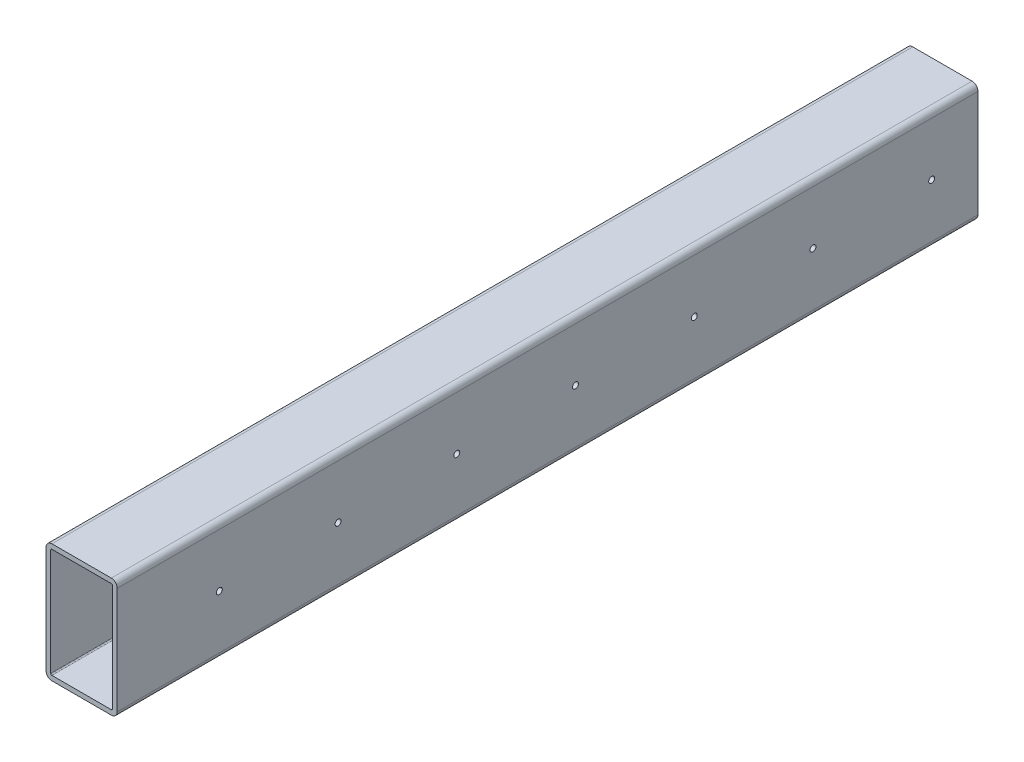
ISO-10303-21;
HEADER;
FILE_DESCRIPTION(('STEP AP214'),'2;1');
FILE_NAME('part.step','',(''),(''),'','','');
FILE_SCHEMA(('AUTOMOTIVE_DESIGN { 1 0 10303 214 1 1 1 1 }'));
ENDSEC;
DATA;
#1=APPLICATION_CONTEXT('core data for automotive mechanical design processes');
#2=APPLICATION_PROTOCOL_DEFINITION('international standard','automotive_design',2000,#1);
#3=PRODUCT_CONTEXT('',#1,'mechanical');
#4=PRODUCT('Part','Part','',(#3));
#5=PRODUCT_RELATED_PRODUCT_CATEGORY('part','',(#4));
#6=PRODUCT_DEFINITION_FORMATION('','',#4);
#7=PRODUCT_DEFINITION_CONTEXT('part definition',#1,'design');
#8=PRODUCT_DEFINITION('design','',#6,#7);
#9=PRODUCT_DEFINITION_SHAPE('','',#8);
#10=(LENGTH_UNIT() NAMED_UNIT(*) SI_UNIT(.MILLI.,.METRE.));
#11=(NAMED_UNIT(*) PLANE_ANGLE_UNIT() SI_UNIT($,.RADIAN.));
#12=(NAMED_UNIT(*) SI_UNIT($,.STERADIAN.) SOLID_ANGLE_UNIT());
#13=UNCERTAINTY_MEASURE_WITH_UNIT(LENGTH_MEASURE(1.E-05),#10,'distance_accuracy_value','');
#14=(GEOMETRIC_REPRESENTATION_CONTEXT(3) GLOBAL_UNCERTAINTY_ASSIGNED_CONTEXT((#13)) GLOBAL_UNIT_ASSIGNED_CONTEXT((#10,
#11,#12)) REPRESENTATION_CONTEXT('',''));
#15=CARTESIAN_POINT('',(0.,0.,0.));
#16=DIRECTION('',(0.,0.,1.));
#17=DIRECTION('',(1.,0.,0.));
#18=AXIS2_PLACEMENT_3D('',#15,#16,#17);
#19=CARTESIAN_POINT('',(50.,-90.0000000000002,725.));
#20=DIRECTION('',(0.,0.,-1.));
#21=DIRECTION('',(0.,1.,0.));
#22=AXIS2_PLACEMENT_3D('',#19,#20,#21);
#23=CYLINDRICAL_SURFACE('',#22,10.);
#24=CARTESIAN_POINT('',(50.,-89.9999999999997,-725.));
#25=DIRECTION('',(0.,0.,1.));
#26=DIRECTION('',(0.,-1.,0.));
#27=AXIS2_PLACEMENT_3D('',#24,#25,#26);
#28=CIRCLE('',#27,10.);
#29=CARTESIAN_POINT('',(50.,-99.9999999999997,-725.));
#30=VERTEX_POINT('',#29);
#31=CARTESIAN_POINT('',(60.,-89.9999999999997,-725.));
#32=VERTEX_POINT('',#31);
#33=EDGE_CURVE('E239',#30,#32,#28,.T.);
#34=ORIENTED_EDGE('',*,*,#33,.T.);
#35=DIRECTION('',(0.,0.,-1.));
#36=VECTOR('',#35,1.);
#37=CARTESIAN_POINT('',(60.,-90.0000000000002,725.));
#38=LINE('',#37,#36);
#39=CARTESIAN_POINT('',(60.,-90.0000000000002,725.));
#40=VERTEX_POINT('',#39);
#41=EDGE_CURVE('E12',#40,#32,#38,.T.);
#42=ORIENTED_EDGE('',*,*,#41,.F.);
#43=CARTESIAN_POINT('',(50.,-90.0000000000002,725.));
#44=DIRECTION('',(0.,0.,1.));
#45=DIRECTION('',(0.,-1.,0.));
#46=AXIS2_PLACEMENT_3D('',#43,#44,#45);
#47=CIRCLE('',#46,10.);
#48=CARTESIAN_POINT('',(50.,-100.,725.));
#49=VERTEX_POINT('',#48);
#50=EDGE_CURVE('E338',#49,#40,#47,.T.);
#51=ORIENTED_EDGE('',*,*,#50,.F.);
#52=DIRECTION('',(0.,0.,-1.));
#53=VECTOR('',#52,1.);
#54=CARTESIAN_POINT('',(50.,-100.,725.));
#55=LINE('',#54,#53);
#56=EDGE_CURVE('E254',#49,#30,#55,.T.);
#57=ORIENTED_EDGE('',*,*,#56,.T.);
#58=EDGE_LOOP('',(#34,#42,#51,#57));
#59=FACE_BOUND('',#58,.T.);
#60=ADVANCED_FACE('F65',(#59),#23,.T.);
#61=CARTESIAN_POINT('',(60.,-90.0000000000002,725.));
#62=DIRECTION('',(-1.,0.,0.));
#63=DIRECTION('',(0.,-1.,0.));
#64=AXIS2_PLACEMENT_3D('',#61,#62,#63);
#65=PLANE('',#64);
#66=CARTESIAN_POINT('',(60.,0.,-647.));
#67=DIRECTION('',(1.,0.,0.));
#68=DIRECTION('',(0.,1.,0.));
#69=AXIS2_PLACEMENT_3D('',#66,#67,#68);
#70=CIRCLE('',#69,5.00000000000004);
#71=CARTESIAN_POINT('',(60.,5.00000000000005,-647.));
#72=VERTEX_POINT('',#71);
#73=EDGE_CURVE('E497',#72,#72,#70,.T.);
#74=ORIENTED_EDGE('',*,*,#73,.F.);
#75=EDGE_LOOP('',(#74));
#76=FACE_BOUND('',#75,.T.);
#77=CARTESIAN_POINT('',(60.,0.,-447.));
#78=DIRECTION('',(1.,0.,0.));
#79=DIRECTION('',(0.,1.,0.));
#80=AXIS2_PLACEMENT_3D('',#77,#78,#79);
#81=CIRCLE('',#80,4.99999999999999);
#82=CARTESIAN_POINT('',(60.,4.99999999999994,-447.));
#83=VERTEX_POINT('',#82);
#84=EDGE_CURVE('E498',#83,#83,#81,.T.);
#85=ORIENTED_EDGE('',*,*,#84,.F.);
#86=EDGE_LOOP('',(#85));
#87=FACE_BOUND('',#86,.T.);
#88=CARTESIAN_POINT('',(60.,-1.15568474330593E-13,-247.));
#89=DIRECTION('',(1.,0.,0.));
#90=DIRECTION('',(0.,1.,0.));
#91=AXIS2_PLACEMENT_3D('',#88,#89,#90);
#92=CIRCLE('',#91,4.99999999999999);
#93=CARTESIAN_POINT('',(60.,4.99999999999987,-247.));
#94=VERTEX_POINT('',#93);
#95=EDGE_CURVE('E508',#94,#94,#92,.T.);
#96=ORIENTED_EDGE('',*,*,#95,.F.);
#97=EDGE_LOOP('',(#96));
#98=FACE_BOUND('',#97,.T.);
#99=CARTESIAN_POINT('',(60.,-1.76822158447843E-13,-46.9999999999999));
#100=DIRECTION('',(1.,0.,0.));
#101=DIRECTION('',(0.,1.,0.));
#102=AXIS2_PLACEMENT_3D('',#99,#100,#101);
#103=CIRCLE('',#102,5.);
#104=CARTESIAN_POINT('',(60.,4.99999999999983,-46.9999999999999));
#105=VERTEX_POINT('',#104);
#106=EDGE_CURVE('E514',#105,#105,#103,.T.);
#107=ORIENTED_EDGE('',*,*,#106,.F.);
#108=EDGE_LOOP('',(#107));
#109=FACE_BOUND('',#108,.T.);
#110=CARTESIAN_POINT('',(60.,-2.38075842565093E-13,153.));
#111=DIRECTION('',(1.,0.,0.));
#112=DIRECTION('',(0.,1.,0.));
#113=AXIS2_PLACEMENT_3D('',#110,#111,#112);
#114=CIRCLE('',#113,4.99999999999999);
#115=CARTESIAN_POINT('',(60.,4.99999999999975,153.));
#116=VERTEX_POINT('',#115);
#117=EDGE_CURVE('E520',#116,#116,#114,.T.);
#118=ORIENTED_EDGE('',*,*,#117,.F.);
#119=EDGE_LOOP('',(#118));
#120=FACE_BOUND('',#119,.T.);
#121=CARTESIAN_POINT('',(60.,-2.99329526682343E-13,353.));
#122=DIRECTION('',(1.,0.,0.));
#123=DIRECTION('',(0.,1.,0.));
#124=AXIS2_PLACEMENT_3D('',#121,#122,#123);
#125=CIRCLE('',#124,4.99999999999999);
#126=CARTESIAN_POINT('',(60.,4.99999999999969,353.));
#127=VERTEX_POINT('',#126);
#128=EDGE_CURVE('E526',#127,#127,#125,.T.);
#129=ORIENTED_EDGE('',*,*,#128,.F.);
#130=EDGE_LOOP('',(#129));
#131=FACE_BOUND('',#130,.T.);
#132=CARTESIAN_POINT('',(60.,-3.60583210799593E-13,553.));
#133=DIRECTION('',(1.,0.,0.));
#134=DIRECTION('',(0.,1.,0.));
#135=AXIS2_PLACEMENT_3D('',#132,#133,#134);
#136=CIRCLE('',#135,5.00000000000004);
#137=CARTESIAN_POINT('',(60.,4.99999999999968,553.));
#138=VERTEX_POINT('',#137);
#139=EDGE_CURVE('E532',#138,#138,#136,.T.);
#140=ORIENTED_EDGE('',*,*,#139,.F.);
#141=EDGE_LOOP('',(#140));
#142=FACE_BOUND('',#141,.T.);
#143=DIRECTION('',(0.,1.,0.));
#144=VECTOR('',#143,1.);
#145=CARTESIAN_POINT('',(60.,-89.9999999999997,-725.));
#146=LINE('',#145,#144);
#147=CARTESIAN_POINT('',(60.,90.0000000000003,-725.));
#148=VERTEX_POINT('',#147);
#149=EDGE_CURVE('E242',#32,#148,#146,.T.);
#150=ORIENTED_EDGE('',*,*,#149,.T.);
#151=DIRECTION('',(0.,0.,-1.));
#152=VECTOR('',#151,1.);
#153=CARTESIAN_POINT('',(60.,89.9999999999999,725.));
#154=LINE('',#153,#152);
#155=CARTESIAN_POINT('',(60.,89.9999999999999,725.));
#156=VERTEX_POINT('',#155);
#157=EDGE_CURVE('E75',#156,#148,#154,.T.);
#158=ORIENTED_EDGE('',*,*,#157,.F.);
#159=DIRECTION('',(0.,1.,0.));
#160=VECTOR('',#159,1.);
#161=CARTESIAN_POINT('',(60.,-90.0000000000002,725.));
#162=LINE('',#161,#160);
#163=EDGE_CURVE('E340',#40,#156,#162,.T.);
#164=ORIENTED_EDGE('',*,*,#163,.F.);
#165=ORIENTED_EDGE('',*,*,#41,.T.);
#166=EDGE_LOOP('',(#150,#158,#164,#165));
#167=FACE_BOUND('',#166,.T.);
#168=ADVANCED_FACE('F378',(#76,#87,#98,#109,#120,#131,#142,#167),#65,.F.);
#169=CARTESIAN_POINT('',(50.,89.9999999999999,725.));
#170=DIRECTION('',(0.,0.,-1.));
#171=DIRECTION('',(0.,1.,0.));
#172=AXIS2_PLACEMENT_3D('',#169,#170,#171);
#173=CYLINDRICAL_SURFACE('',#172,10.);
#174=CARTESIAN_POINT('',(50.,90.0000000000003,-725.));
#175=DIRECTION('',(0.,0.,1.));
#176=DIRECTION('',(0.,-1.,0.));
#177=AXIS2_PLACEMENT_3D('',#174,#175,#176);
#178=CIRCLE('',#177,10.);
#179=CARTESIAN_POINT('',(50.,100.,-725.));
#180=VERTEX_POINT('',#179);
#181=EDGE_CURVE('E244',#148,#180,#178,.T.);
#182=ORIENTED_EDGE('',*,*,#181,.T.);
#183=DIRECTION('',(0.,0.,-1.));
#184=VECTOR('',#183,1.);
#185=CARTESIAN_POINT('',(50.,99.9999999999999,725.));
#186=LINE('',#185,#184);
#187=CARTESIAN_POINT('',(50.,99.9999999999999,725.));
#188=VERTEX_POINT('',#187);
#189=EDGE_CURVE('E261',#188,#180,#186,.T.);
#190=ORIENTED_EDGE('',*,*,#189,.F.);
#191=CARTESIAN_POINT('',(50.,89.9999999999999,725.));
#192=DIRECTION('',(0.,0.,1.));
#193=DIRECTION('',(0.,-1.,0.));
#194=AXIS2_PLACEMENT_3D('',#191,#192,#193);
#195=CIRCLE('',#194,10.);
#196=EDGE_CURVE('E342',#156,#188,#195,.T.);
#197=ORIENTED_EDGE('',*,*,#196,.F.);
#198=ORIENTED_EDGE('',*,*,#157,.T.);
#199=EDGE_LOOP('',(#182,#190,#197,#198));
#200=FACE_BOUND('',#199,.T.);
#201=ADVANCED_FACE('F383',(#200),#173,.T.);
#202=CARTESIAN_POINT('',(-50.,99.9999999999998,725.));
#203=DIRECTION('',(0.,-1.,0.));
#204=DIRECTION('',(0.,0.,-1.));
#205=AXIS2_PLACEMENT_3D('',#202,#203,#204);
#206=PLANE('',#205);
#207=DIRECTION('',(-1.,0.,0.));
#208=VECTOR('',#207,1.);
#209=CARTESIAN_POINT('',(-50.,100.,-725.));
#210=LINE('',#209,#208);
#211=CARTESIAN_POINT('',(-50.,100.,-725.));
#212=VERTEX_POINT('',#211);
#213=EDGE_CURVE('E246',#180,#212,#210,.T.);
#214=ORIENTED_EDGE('',*,*,#213,.T.);
#215=DIRECTION('',(0.,0.,-1.));
#216=VECTOR('',#215,1.);
#217=CARTESIAN_POINT('',(-50.,99.9999999999998,725.));
#218=LINE('',#217,#216);
#219=CARTESIAN_POINT('',(-50.,99.9999999999998,725.));
#220=VERTEX_POINT('',#219);
#221=EDGE_CURVE('E258',#220,#212,#218,.T.);
#222=ORIENTED_EDGE('',*,*,#221,.F.);
#223=DIRECTION('',(-1.,0.,0.));
#224=VECTOR('',#223,1.);
#225=CARTESIAN_POINT('',(-50.,99.9999999999998,725.));
#226=LINE('',#225,#224);
#227=EDGE_CURVE('E344',#188,#220,#226,.T.);
#228=ORIENTED_EDGE('',*,*,#227,.F.);
#229=ORIENTED_EDGE('',*,*,#189,.T.);
#230=EDGE_LOOP('',(#214,#222,#228,#229));
#231=FACE_BOUND('',#230,.T.);
#232=ADVANCED_FACE('F350',(#231),#206,.F.);
#233=CARTESIAN_POINT('',(-50.,89.9999999999998,725.));
#234=DIRECTION('',(0.,0.,-1.));
#235=DIRECTION('',(0.,1.,0.));
#236=AXIS2_PLACEMENT_3D('',#233,#234,#235);
#237=CYLINDRICAL_SURFACE('',#236,10.);
#238=CARTESIAN_POINT('',(-50.,90.0000000000003,-725.));
#239=DIRECTION('',(0.,0.,1.));
#240=DIRECTION('',(0.,-1.,0.));
#241=AXIS2_PLACEMENT_3D('',#238,#239,#240);
#242=CIRCLE('',#241,10.);
#243=CARTESIAN_POINT('',(-60.,90.0000000000003,-725.));
#244=VERTEX_POINT('',#243);
#245=EDGE_CURVE('E248',#212,#244,#242,.T.);
#246=ORIENTED_EDGE('',*,*,#245,.T.);
#247=DIRECTION('',(0.,0.,-1.));
#248=VECTOR('',#247,1.);
#249=CARTESIAN_POINT('',(-60.,89.9999999999999,725.));
#250=LINE('',#249,#248);
#251=CARTESIAN_POINT('',(-60.,89.9999999999999,725.));
#252=VERTEX_POINT('',#251);
#253=EDGE_CURVE('E205',#252,#244,#250,.T.);
#254=ORIENTED_EDGE('',*,*,#253,.F.);
#255=CARTESIAN_POINT('',(-50.,89.9999999999998,725.));
#256=DIRECTION('',(0.,0.,1.));
#257=DIRECTION('',(0.,-1.,0.));
#258=AXIS2_PLACEMENT_3D('',#255,#256,#257);
#259=CIRCLE('',#258,10.);
#260=EDGE_CURVE('E196',#220,#252,#259,.T.);
#261=ORIENTED_EDGE('',*,*,#260,.F.);
#262=ORIENTED_EDGE('',*,*,#221,.T.);
#263=EDGE_LOOP('',(#246,#254,#261,#262));
#264=FACE_BOUND('',#263,.T.);
#265=ADVANCED_FACE('F354',(#264),#237,.T.);
#266=CARTESIAN_POINT('',(-60.,89.9999999999999,725.));
#267=DIRECTION('',(1.,0.,0.));
#268=DIRECTION('',(0.,1.,0.));
#269=AXIS2_PLACEMENT_3D('',#266,#267,#268);
#270=PLANE('',#269);
#271=CARTESIAN_POINT('',(-60.,0.,-647.));
#272=DIRECTION('',(1.,0.,0.));
#273=DIRECTION('',(0.,1.,0.));
#274=AXIS2_PLACEMENT_3D('',#271,#272,#273);
#275=CIRCLE('',#274,5.00000000000004);
#276=CARTESIAN_POINT('',(-60.,5.00000000000004,-647.));
#277=VERTEX_POINT('',#276);
#278=EDGE_CURVE('E284',#277,#277,#275,.T.);
#279=ORIENTED_EDGE('',*,*,#278,.T.);
#280=EDGE_LOOP('',(#279));
#281=FACE_BOUND('',#280,.T.);
#282=CARTESIAN_POINT('',(-60.,0.,-447.));
#283=DIRECTION('',(1.,0.,0.));
#284=DIRECTION('',(0.,1.,0.));
#285=AXIS2_PLACEMENT_3D('',#282,#283,#284);
#286=CIRCLE('',#285,4.99999999999999);
#287=CARTESIAN_POINT('',(-60.,4.99999999999992,-447.));
#288=VERTEX_POINT('',#287);
#289=EDGE_CURVE('E503',#288,#288,#286,.T.);
#290=ORIENTED_EDGE('',*,*,#289,.T.);
#291=EDGE_LOOP('',(#290));
#292=FACE_BOUND('',#291,.T.);
#293=CARTESIAN_POINT('',(-60.,-1.29446262138407E-13,-247.));
#294=DIRECTION('',(1.,0.,0.));
#295=DIRECTION('',(0.,1.,0.));
#296=AXIS2_PLACEMENT_3D('',#293,#294,#295);
#297=CIRCLE('',#296,4.99999999999999);
#298=CARTESIAN_POINT('',(-60.,4.99999999999986,-247.));
#299=VERTEX_POINT('',#298);
#300=EDGE_CURVE('E511',#299,#299,#297,.T.);
#301=ORIENTED_EDGE('',*,*,#300,.T.);
#302=EDGE_LOOP('',(#301));
#303=FACE_BOUND('',#302,.T.);
#304=CARTESIAN_POINT('',(-60.,-1.90699946255657E-13,-46.9999999999999));
#305=DIRECTION('',(1.,0.,0.));
#306=DIRECTION('',(0.,1.,0.));
#307=AXIS2_PLACEMENT_3D('',#304,#305,#306);
#308=CIRCLE('',#307,5.);
#309=CARTESIAN_POINT('',(-60.,4.99999999999981,-46.9999999999999));
#310=VERTEX_POINT('',#309);
#311=EDGE_CURVE('E517',#310,#310,#308,.T.);
#312=ORIENTED_EDGE('',*,*,#311,.T.);
#313=EDGE_LOOP('',(#312));
#314=FACE_BOUND('',#313,.T.);
#315=CARTESIAN_POINT('',(-60.,-2.51953630372907E-13,153.));
#316=DIRECTION('',(1.,0.,0.));
#317=DIRECTION('',(0.,1.,0.));
#318=AXIS2_PLACEMENT_3D('',#315,#316,#317);
#319=CIRCLE('',#318,4.99999999999999);
#320=CARTESIAN_POINT('',(-60.,4.99999999999974,153.));
#321=VERTEX_POINT('',#320);
#322=EDGE_CURVE('E523',#321,#321,#319,.T.);
#323=ORIENTED_EDGE('',*,*,#322,.T.);
#324=EDGE_LOOP('',(#323));
#325=FACE_BOUND('',#324,.T.);
#326=CARTESIAN_POINT('',(-60.,-3.13207314490157E-13,353.));
#327=DIRECTION('',(1.,0.,0.));
#328=DIRECTION('',(0.,1.,0.));
#329=AXIS2_PLACEMENT_3D('',#326,#327,#328);
#330=CIRCLE('',#329,4.99999999999999);
#331=CARTESIAN_POINT('',(-60.,4.99999999999968,353.));
#332=VERTEX_POINT('',#331);
#333=EDGE_CURVE('E529',#332,#332,#330,.T.);
#334=ORIENTED_EDGE('',*,*,#333,.T.);
#335=EDGE_LOOP('',(#334));
#336=FACE_BOUND('',#335,.T.);
#337=CARTESIAN_POINT('',(-60.,-3.74460998607407E-13,553.));
#338=DIRECTION('',(1.,0.,0.));
#339=DIRECTION('',(0.,1.,0.));
#340=AXIS2_PLACEMENT_3D('',#337,#338,#339);
#341=CIRCLE('',#340,5.00000000000004);
#342=CARTESIAN_POINT('',(-60.,4.99999999999967,553.));
#343=VERTEX_POINT('',#342);
#344=EDGE_CURVE('E535',#343,#343,#341,.T.);
#345=ORIENTED_EDGE('',*,*,#344,.T.);
#346=EDGE_LOOP('',(#345));
#347=FACE_BOUND('',#346,.T.);
#348=DIRECTION('',(0.,-1.,0.));
#349=VECTOR('',#348,1.);
#350=CARTESIAN_POINT('',(-60.,90.0000000000003,-725.));
#351=LINE('',#350,#349);
#352=CARTESIAN_POINT('',(-60.,-89.9999999999997,-725.));
#353=VERTEX_POINT('',#352);
#354=EDGE_CURVE('E204',#244,#353,#351,.T.);
#355=ORIENTED_EDGE('',*,*,#354,.T.);
#356=DIRECTION('',(0.,0.,-1.));
#357=VECTOR('',#356,1.);
#358=CARTESIAN_POINT('',(-60.,-90.0000000000002,725.));
#359=LINE('',#358,#357);
#360=CARTESIAN_POINT('',(-60.,-90.0000000000002,725.));
#361=VERTEX_POINT('',#360);
#362=EDGE_CURVE('E201',#361,#353,#359,.T.);
#363=ORIENTED_EDGE('',*,*,#362,.F.);
#364=DIRECTION('',(0.,-1.,0.));
#365=VECTOR('',#364,1.);
#366=CARTESIAN_POINT('',(-60.,89.9999999999999,725.));
#367=LINE('',#366,#365);
#368=EDGE_CURVE('E190',#252,#361,#367,.T.);
#369=ORIENTED_EDGE('',*,*,#368,.F.);
#370=ORIENTED_EDGE('',*,*,#253,.T.);
#371=EDGE_LOOP('',(#355,#363,#369,#370));
#372=FACE_BOUND('',#371,.T.);
#373=ADVANCED_FACE('F202',(#281,#292,#303,#314,#325,#336,#347,#372),#270,.F.);
#374=CARTESIAN_POINT('',(-50.,-90.0000000000002,725.));
#375=DIRECTION('',(0.,0.,-1.));
#376=DIRECTION('',(0.,1.,0.));
#377=AXIS2_PLACEMENT_3D('',#374,#375,#376);
#378=CYLINDRICAL_SURFACE('',#377,10.);
#379=CARTESIAN_POINT('',(-50.,-89.9999999999997,-725.));
#380=DIRECTION('',(0.,0.,1.));
#381=DIRECTION('',(0.,-1.,0.));
#382=AXIS2_PLACEMENT_3D('',#379,#380,#381);
#383=CIRCLE('',#382,10.);
#384=CARTESIAN_POINT('',(-50.,-99.9999999999997,-725.));
#385=VERTEX_POINT('',#384);
#386=EDGE_CURVE('E137',#353,#385,#383,.T.);
#387=ORIENTED_EDGE('',*,*,#386,.T.);
#388=DIRECTION('',(0.,0.,-1.));
#389=VECTOR('',#388,1.);
#390=CARTESIAN_POINT('',(-50.,-100.,725.));
#391=LINE('',#390,#389);
#392=CARTESIAN_POINT('',(-50.,-100.,725.));
#393=VERTEX_POINT('',#392);
#394=EDGE_CURVE('E206',#393,#385,#391,.T.);
#395=ORIENTED_EDGE('',*,*,#394,.F.);
#396=CARTESIAN_POINT('',(-50.,-90.0000000000002,725.));
#397=DIRECTION('',(0.,0.,1.));
#398=DIRECTION('',(0.,-1.,0.));
#399=AXIS2_PLACEMENT_3D('',#396,#397,#398);
#400=CIRCLE('',#399,10.);
#401=EDGE_CURVE('E194',#361,#393,#400,.T.);
#402=ORIENTED_EDGE('',*,*,#401,.F.);
#403=ORIENTED_EDGE('',*,*,#362,.T.);
#404=EDGE_LOOP('',(#387,#395,#402,#403));
#405=FACE_BOUND('',#404,.T.);
#406=ADVANCED_FACE('F208',(#405),#378,.T.);
#407=CARTESIAN_POINT('',(50.,89.9999999999999,725.));
#408=DIRECTION('',(0.,0.,-1.));
#409=DIRECTION('',(0.,1.,0.));
#410=AXIS2_PLACEMENT_3D('',#407,#408,#409);
#411=CYLINDRICAL_SURFACE('',#410,2.00000000000002);
#412=CARTESIAN_POINT('',(50.,90.0000000000003,-725.));
#413=DIRECTION('',(0.,0.,1.));
#414=DIRECTION('',(0.,-1.,0.));
#415=AXIS2_PLACEMENT_3D('',#412,#413,#414);
#416=CIRCLE('',#415,2.00000000000002);
#417=CARTESIAN_POINT('',(52.,90.0000000000003,-725.));
#418=VERTEX_POINT('',#417);
#419=CARTESIAN_POINT('',(50.,92.0000000000003,-725.));
#420=VERTEX_POINT('',#419);
#421=EDGE_CURVE('E214',#418,#420,#416,.T.);
#422=ORIENTED_EDGE('',*,*,#421,.F.);
#423=DIRECTION('',(0.,0.,-1.));
#424=VECTOR('',#423,1.);
#425=CARTESIAN_POINT('',(52.,89.9999999999998,725.));
#426=LINE('',#425,#424);
#427=CARTESIAN_POINT('',(52.,89.9999999999998,725.));
#428=VERTEX_POINT('',#427);
#429=EDGE_CURVE('E151',#428,#418,#426,.T.);
#430=ORIENTED_EDGE('',*,*,#429,.F.);
#431=CARTESIAN_POINT('',(50.,89.9999999999999,725.));
#432=DIRECTION('',(0.,0.,1.));
#433=DIRECTION('',(0.,-1.,0.));
#434=AXIS2_PLACEMENT_3D('',#431,#432,#433);
#435=CIRCLE('',#434,2.00000000000002);
#436=CARTESIAN_POINT('',(50.,91.9999999999999,725.));
#437=VERTEX_POINT('',#436);
#438=EDGE_CURVE('E253',#428,#437,#435,.T.);
#439=ORIENTED_EDGE('',*,*,#438,.T.);
#440=DIRECTION('',(0.,0.,-1.));
#441=VECTOR('',#440,1.);
#442=CARTESIAN_POINT('',(50.,91.9999999999999,725.));
#443=LINE('',#442,#441);
#444=EDGE_CURVE('E210',#437,#420,#443,.T.);
#445=ORIENTED_EDGE('',*,*,#444,.T.);
#446=EDGE_LOOP('',(#422,#430,#439,#445));
#447=FACE_BOUND('',#446,.T.);
#448=ADVANCED_FACE('F67',(#447),#411,.F.);
#449=CARTESIAN_POINT('',(52.,-90.0000000000002,725.));
#450=DIRECTION('',(-1.,0.,0.));
#451=DIRECTION('',(0.,-1.,0.));
#452=AXIS2_PLACEMENT_3D('',#449,#450,#451);
#453=PLANE('',#452);
#454=CARTESIAN_POINT('',(52.,0.,-647.));
#455=DIRECTION('',(-1.,0.,0.));
#456=DIRECTION('',(0.,-1.,0.));
#457=AXIS2_PLACEMENT_3D('',#454,#455,#456);
#458=CIRCLE('',#457,5.00000000000004);
#459=CARTESIAN_POINT('',(52.,-5.00000000000004,-647.));
#460=VERTEX_POINT('',#459);
#461=EDGE_CURVE('E218',#460,#460,#458,.T.);
#462=ORIENTED_EDGE('',*,*,#461,.F.);
#463=EDGE_LOOP('',(#462));
#464=FACE_BOUND('',#463,.T.);
#465=CARTESIAN_POINT('',(52.,0.,-447.));
#466=DIRECTION('',(-1.,0.,0.));
#467=DIRECTION('',(0.,-1.,0.));
#468=AXIS2_PLACEMENT_3D('',#465,#466,#467);
#469=CIRCLE('',#468,4.99999999999999);
#470=CARTESIAN_POINT('',(52.,-5.00000000000005,-447.));
#471=VERTEX_POINT('',#470);
#472=EDGE_CURVE('E302',#471,#471,#469,.T.);
#473=ORIENTED_EDGE('',*,*,#472,.F.);
#474=EDGE_LOOP('',(#473));
#475=FACE_BOUND('',#474,.T.);
#476=CARTESIAN_POINT('',(52.,-1.16493660184447E-13,-247.));
#477=DIRECTION('',(-1.,0.,0.));
#478=DIRECTION('',(0.,-1.,0.));
#479=AXIS2_PLACEMENT_3D('',#476,#477,#478);
#480=CIRCLE('',#479,4.99999999999999);
#481=CARTESIAN_POINT('',(52.,-5.00000000000011,-247.));
#482=VERTEX_POINT('',#481);
#483=EDGE_CURVE('E299',#482,#482,#480,.T.);
#484=ORIENTED_EDGE('',*,*,#483,.F.);
#485=EDGE_LOOP('',(#484));
#486=FACE_BOUND('',#485,.T.);
#487=CARTESIAN_POINT('',(52.,-1.77747344301697E-13,-46.9999999999999));
#488=DIRECTION('',(-1.,0.,0.));
#489=DIRECTION('',(0.,-1.,0.));
#490=AXIS2_PLACEMENT_3D('',#487,#488,#489);
#491=CIRCLE('',#490,5.);
#492=CARTESIAN_POINT('',(52.,-5.00000000000018,-46.9999999999999));
#493=VERTEX_POINT('',#492);
#494=EDGE_CURVE('E296',#493,#493,#491,.T.);
#495=ORIENTED_EDGE('',*,*,#494,.F.);
#496=EDGE_LOOP('',(#495));
#497=FACE_BOUND('',#496,.T.);
#498=CARTESIAN_POINT('',(52.,-2.39001028418947E-13,153.));
#499=DIRECTION('',(-1.,0.,0.));
#500=DIRECTION('',(0.,-1.,0.));
#501=AXIS2_PLACEMENT_3D('',#498,#499,#500);
#502=CIRCLE('',#501,4.99999999999999);
#503=CARTESIAN_POINT('',(52.,-5.00000000000023,153.));
#504=VERTEX_POINT('',#503);
#505=EDGE_CURVE('E292',#504,#504,#502,.T.);
#506=ORIENTED_EDGE('',*,*,#505,.F.);
#507=EDGE_LOOP('',(#506));
#508=FACE_BOUND('',#507,.T.);
#509=CARTESIAN_POINT('',(52.,-3.00254712536197E-13,353.));
#510=DIRECTION('',(-1.,0.,0.));
#511=DIRECTION('',(0.,-1.,0.));
#512=AXIS2_PLACEMENT_3D('',#509,#510,#511);
#513=CIRCLE('',#512,4.99999999999999);
#514=CARTESIAN_POINT('',(52.,-5.00000000000029,353.));
#515=VERTEX_POINT('',#514);
#516=EDGE_CURVE('E288',#515,#515,#513,.T.);
#517=ORIENTED_EDGE('',*,*,#516,.F.);
#518=EDGE_LOOP('',(#517));
#519=FACE_BOUND('',#518,.T.);
#520=CARTESIAN_POINT('',(52.,-3.61508396653447E-13,553.));
#521=DIRECTION('',(-1.,0.,0.));
#522=DIRECTION('',(0.,-1.,0.));
#523=AXIS2_PLACEMENT_3D('',#520,#521,#522);
#524=CIRCLE('',#523,5.00000000000004);
#525=CARTESIAN_POINT('',(52.,-5.00000000000041,553.));
#526=VERTEX_POINT('',#525);
#527=EDGE_CURVE('E283',#526,#526,#524,.T.);
#528=ORIENTED_EDGE('',*,*,#527,.F.);
#529=EDGE_LOOP('',(#528));
#530=FACE_BOUND('',#529,.T.);
#531=DIRECTION('',(0.,1.,0.));
#532=VECTOR('',#531,1.);
#533=CARTESIAN_POINT('',(52.,-89.9999999999997,-725.));
#534=LINE('',#533,#532);
#535=CARTESIAN_POINT('',(52.,-89.9999999999997,-725.));
#536=VERTEX_POINT('',#535);
#537=EDGE_CURVE('E217',#536,#418,#534,.T.);
#538=ORIENTED_EDGE('',*,*,#537,.F.);
#539=DIRECTION('',(0.,0.,-1.));
#540=VECTOR('',#539,1.);
#541=CARTESIAN_POINT('',(52.,-90.0000000000002,725.));
#542=LINE('',#541,#540);
#543=CARTESIAN_POINT('',(52.,-90.0000000000002,725.));
#544=VERTEX_POINT('',#543);
#545=EDGE_CURVE('E277',#544,#536,#542,.T.);
#546=ORIENTED_EDGE('',*,*,#545,.F.);
#547=DIRECTION('',(0.,1.,0.));
#548=VECTOR('',#547,1.);
#549=CARTESIAN_POINT('',(52.,-90.0000000000002,725.));
#550=LINE('',#549,#548);
#551=EDGE_CURVE('E317',#544,#428,#550,.T.);
#552=ORIENTED_EDGE('',*,*,#551,.T.);
#553=ORIENTED_EDGE('',*,*,#429,.T.);
#554=EDGE_LOOP('',(#538,#546,#552,#553));
#555=FACE_BOUND('',#554,.T.);
#556=ADVANCED_FACE('F405',(#464,#475,#486,#497,#508,#519,#530,#555),#453,.T.);
#557=CARTESIAN_POINT('',(50.,-90.0000000000002,725.));
#558=DIRECTION('',(0.,0.,-1.));
#559=DIRECTION('',(0.,1.,0.));
#560=AXIS2_PLACEMENT_3D('',#557,#558,#559);
#561=CYLINDRICAL_SURFACE('',#560,2.00000000000002);
#562=CARTESIAN_POINT('',(50.,-89.9999999999997,-725.));
#563=DIRECTION('',(0.,0.,1.));
#564=DIRECTION('',(0.,-1.,0.));
#565=AXIS2_PLACEMENT_3D('',#562,#563,#564);
#566=CIRCLE('',#565,2.00000000000002);
#567=CARTESIAN_POINT('',(50.,-91.9999999999998,-725.));
#568=VERTEX_POINT('',#567);
#569=EDGE_CURVE('E221',#568,#536,#566,.T.);
#570=ORIENTED_EDGE('',*,*,#569,.F.);
#571=DIRECTION('',(0.,0.,-1.));
#572=VECTOR('',#571,1.);
#573=CARTESIAN_POINT('',(50.,-92.0000000000002,725.));
#574=LINE('',#573,#572);
#575=CARTESIAN_POINT('',(50.,-92.0000000000002,725.));
#576=VERTEX_POINT('',#575);
#577=EDGE_CURVE('E275',#576,#568,#574,.T.);
#578=ORIENTED_EDGE('',*,*,#577,.F.);
#579=CARTESIAN_POINT('',(50.,-90.0000000000002,725.));
#580=DIRECTION('',(0.,0.,1.));
#581=DIRECTION('',(0.,-1.,0.));
#582=AXIS2_PLACEMENT_3D('',#579,#580,#581);
#583=CIRCLE('',#582,2.00000000000002);
#584=EDGE_CURVE('E320',#576,#544,#583,.T.);
#585=ORIENTED_EDGE('',*,*,#584,.T.);
#586=ORIENTED_EDGE('',*,*,#545,.T.);
#587=EDGE_LOOP('',(#570,#578,#585,#586));
#588=FACE_BOUND('',#587,.T.);
#589=ADVANCED_FACE('F402',(#588),#561,.F.);
#590=CARTESIAN_POINT('',(50.,-92.0000000000002,725.));
#591=DIRECTION('',(0.,1.,0.));
#592=DIRECTION('',(0.,0.,1.));
#593=AXIS2_PLACEMENT_3D('',#590,#591,#592);
#594=PLANE('',#593);
#595=DIRECTION('',(1.,0.,0.));
#596=VECTOR('',#595,1.);
#597=CARTESIAN_POINT('',(50.,-91.9999999999997,-725.));
#598=LINE('',#597,#596);
#599=CARTESIAN_POINT('',(-50.,-91.9999999999997,-725.));
#600=VERTEX_POINT('',#599);
#601=EDGE_CURVE('E224',#600,#568,#598,.T.);
#602=ORIENTED_EDGE('',*,*,#601,.F.);
#603=DIRECTION('',(0.,0.,-1.));
#604=VECTOR('',#603,1.);
#605=CARTESIAN_POINT('',(-50.,-92.0000000000002,725.));
#606=LINE('',#605,#604);
#607=CARTESIAN_POINT('',(-50.,-92.0000000000002,725.));
#608=VERTEX_POINT('',#607);
#609=EDGE_CURVE('E273',#608,#600,#606,.T.);
#610=ORIENTED_EDGE('',*,*,#609,.F.);
#611=DIRECTION('',(1.,0.,0.));
#612=VECTOR('',#611,1.);
#613=CARTESIAN_POINT('',(50.,-92.0000000000002,725.));
#614=LINE('',#613,#612);
#615=EDGE_CURVE('E323',#608,#576,#614,.T.);
#616=ORIENTED_EDGE('',*,*,#615,.T.);
#617=ORIENTED_EDGE('',*,*,#577,.T.);
#618=EDGE_LOOP('',(#602,#610,#616,#617));
#619=FACE_BOUND('',#618,.T.);
#620=ADVANCED_FACE('F398',(#619),#594,.T.);
#621=CARTESIAN_POINT('',(-50.,-90.0000000000002,725.));
#622=DIRECTION('',(0.,0.,-1.));
#623=DIRECTION('',(0.,1.,0.));
#624=AXIS2_PLACEMENT_3D('',#621,#622,#623);
#625=CYLINDRICAL_SURFACE('',#624,2.00000000000002);
#626=CARTESIAN_POINT('',(-50.,-89.9999999999997,-725.));
#627=DIRECTION('',(0.,0.,1.));
#628=DIRECTION('',(0.,-1.,0.));
#629=AXIS2_PLACEMENT_3D('',#626,#627,#628);
#630=CIRCLE('',#629,2.00000000000002);
#631=CARTESIAN_POINT('',(-52.,-89.9999999999997,-725.));
#632=VERTEX_POINT('',#631);
#633=EDGE_CURVE('E227',#632,#600,#630,.T.);
#634=ORIENTED_EDGE('',*,*,#633,.F.);
#635=DIRECTION('',(0.,0.,-1.));
#636=VECTOR('',#635,1.);
#637=CARTESIAN_POINT('',(-52.,-90.0000000000002,725.));
#638=LINE('',#637,#636);
#639=CARTESIAN_POINT('',(-52.,-90.0000000000002,725.));
#640=VERTEX_POINT('',#639);
#641=EDGE_CURVE('E271',#640,#632,#638,.T.);
#642=ORIENTED_EDGE('',*,*,#641,.F.);
#643=CARTESIAN_POINT('',(-50.,-90.0000000000002,725.));
#644=DIRECTION('',(0.,0.,1.));
#645=DIRECTION('',(0.,-1.,0.));
#646=AXIS2_PLACEMENT_3D('',#643,#644,#645);
#647=CIRCLE('',#646,2.00000000000002);
#648=EDGE_CURVE('E326',#640,#608,#647,.T.);
#649=ORIENTED_EDGE('',*,*,#648,.T.);
#650=ORIENTED_EDGE('',*,*,#609,.T.);
#651=EDGE_LOOP('',(#634,#642,#649,#650));
#652=FACE_BOUND('',#651,.T.);
#653=ADVANCED_FACE('F394',(#652),#625,.F.);
#654=CARTESIAN_POINT('',(-52.,89.9999999999998,725.));
#655=DIRECTION('',(1.,0.,0.));
#656=DIRECTION('',(0.,1.,0.));
#657=AXIS2_PLACEMENT_3D('',#654,#655,#656);
#658=PLANE('',#657);
#659=CARTESIAN_POINT('',(-52.,0.,-647.));
#660=DIRECTION('',(1.,0.,0.));
#661=DIRECTION('',(0.,1.,0.));
#662=AXIS2_PLACEMENT_3D('',#659,#660,#661);
#663=CIRCLE('',#662,5.00000000000004);
#664=CARTESIAN_POINT('',(-52.,5.00000000000004,-647.));
#665=VERTEX_POINT('',#664);
#666=EDGE_CURVE('E69',#665,#665,#663,.T.);
#667=ORIENTED_EDGE('',*,*,#666,.F.);
#668=EDGE_LOOP('',(#667));
#669=FACE_BOUND('',#668,.T.);
#670=CARTESIAN_POINT('',(-52.,0.,-447.));
#671=DIRECTION('',(1.,0.,0.));
#672=DIRECTION('',(0.,1.,0.));
#673=AXIS2_PLACEMENT_3D('',#670,#671,#672);
#674=CIRCLE('',#673,4.99999999999999);
#675=CARTESIAN_POINT('',(-52.,4.99999999999992,-447.));
#676=VERTEX_POINT('',#675);
#677=EDGE_CURVE('E300',#676,#676,#674,.T.);
#678=ORIENTED_EDGE('',*,*,#677,.F.);
#679=EDGE_LOOP('',(#678));
#680=FACE_BOUND('',#679,.T.);
#681=CARTESIAN_POINT('',(-52.,-1.28521076284553E-13,-247.));
#682=DIRECTION('',(1.,0.,0.));
#683=DIRECTION('',(0.,1.,0.));
#684=AXIS2_PLACEMENT_3D('',#681,#682,#683);
#685=CIRCLE('',#684,4.99999999999999);
#686=CARTESIAN_POINT('',(-52.,4.99999999999986,-247.));
#687=VERTEX_POINT('',#686);
#688=EDGE_CURVE('E297',#687,#687,#685,.T.);
#689=ORIENTED_EDGE('',*,*,#688,.F.);
#690=EDGE_LOOP('',(#689));
#691=FACE_BOUND('',#690,.T.);
#692=CARTESIAN_POINT('',(-52.,-1.89774760401803E-13,-46.9999999999999));
#693=DIRECTION('',(1.,0.,0.));
#694=DIRECTION('',(0.,1.,0.));
#695=AXIS2_PLACEMENT_3D('',#692,#693,#694);
#696=CIRCLE('',#695,5.);
#697=CARTESIAN_POINT('',(-52.,4.99999999999981,-46.9999999999999));
#698=VERTEX_POINT('',#697);
#699=EDGE_CURVE('E293',#698,#698,#696,.T.);
#700=ORIENTED_EDGE('',*,*,#699,.F.);
#701=EDGE_LOOP('',(#700));
#702=FACE_BOUND('',#701,.T.);
#703=CARTESIAN_POINT('',(-52.,-2.51028444519053E-13,153.));
#704=DIRECTION('',(1.,0.,0.));
#705=DIRECTION('',(0.,1.,0.));
#706=AXIS2_PLACEMENT_3D('',#703,#704,#705);
#707=CIRCLE('',#706,4.99999999999999);
#708=CARTESIAN_POINT('',(-52.,4.99999999999974,153.));
#709=VERTEX_POINT('',#708);
#710=EDGE_CURVE('E289',#709,#709,#707,.T.);
#711=ORIENTED_EDGE('',*,*,#710,.F.);
#712=EDGE_LOOP('',(#711));
#713=FACE_BOUND('',#712,.T.);
#714=CARTESIAN_POINT('',(-52.,-3.12282128636303E-13,353.));
#715=DIRECTION('',(1.,0.,0.));
#716=DIRECTION('',(0.,1.,0.));
#717=AXIS2_PLACEMENT_3D('',#714,#715,#716);
#718=CIRCLE('',#717,4.99999999999999);
#719=CARTESIAN_POINT('',(-52.,4.99999999999968,353.));
#720=VERTEX_POINT('',#719);
#721=EDGE_CURVE('E285',#720,#720,#718,.T.);
#722=ORIENTED_EDGE('',*,*,#721,.F.);
#723=EDGE_LOOP('',(#722));
#724=FACE_BOUND('',#723,.T.);
#725=CARTESIAN_POINT('',(-52.,-3.73535812753553E-13,553.));
#726=DIRECTION('',(1.,0.,0.));
#727=DIRECTION('',(0.,1.,0.));
#728=AXIS2_PLACEMENT_3D('',#725,#726,#727);
#729=CIRCLE('',#728,5.00000000000004);
#730=CARTESIAN_POINT('',(-52.,4.99999999999967,553.));
#731=VERTEX_POINT('',#730);
#732=EDGE_CURVE('E280',#731,#731,#729,.T.);
#733=ORIENTED_EDGE('',*,*,#732,.F.);
#734=EDGE_LOOP('',(#733));
#735=FACE_BOUND('',#734,.T.);
#736=DIRECTION('',(0.,-1.,0.));
#737=VECTOR('',#736,1.);
#738=CARTESIAN_POINT('',(-52.,90.0000000000003,-725.));
#739=LINE('',#738,#737);
#740=CARTESIAN_POINT('',(-52.,90.0000000000003,-725.));
#741=VERTEX_POINT('',#740);
#742=EDGE_CURVE('E230',#741,#632,#739,.T.);
#743=ORIENTED_EDGE('',*,*,#742,.F.);
#744=DIRECTION('',(0.,0.,-1.));
#745=VECTOR('',#744,1.);
#746=CARTESIAN_POINT('',(-52.,89.9999999999998,725.));
#747=LINE('',#746,#745);
#748=CARTESIAN_POINT('',(-52.,89.9999999999998,725.));
#749=VERTEX_POINT('',#748);
#750=EDGE_CURVE('E269',#749,#741,#747,.T.);
#751=ORIENTED_EDGE('',*,*,#750,.F.);
#752=DIRECTION('',(0.,-1.,0.));
#753=VECTOR('',#752,1.);
#754=CARTESIAN_POINT('',(-52.,89.9999999999998,725.));
#755=LINE('',#754,#753);
#756=EDGE_CURVE('E329',#749,#640,#755,.T.);
#757=ORIENTED_EDGE('',*,*,#756,.T.);
#758=ORIENTED_EDGE('',*,*,#641,.T.);
#759=EDGE_LOOP('',(#743,#751,#757,#758));
#760=FACE_BOUND('',#759,.T.);
#761=ADVANCED_FACE('F390',(#669,#680,#691,#702,#713,#724,#735,#760),#658,.T.);
#762=CARTESIAN_POINT('',(-50.,89.9999999999998,725.));
#763=DIRECTION('',(0.,0.,-1.));
#764=DIRECTION('',(0.,1.,0.));
#765=AXIS2_PLACEMENT_3D('',#762,#763,#764);
#766=CYLINDRICAL_SURFACE('',#765,2.);
#767=CARTESIAN_POINT('',(-50.,90.0000000000003,-725.));
#768=DIRECTION('',(0.,0.,1.));
#769=DIRECTION('',(0.,-1.,0.));
#770=AXIS2_PLACEMENT_3D('',#767,#768,#769);
#771=CIRCLE('',#770,2.);
#772=CARTESIAN_POINT('',(-50.,92.0000000000003,-725.));
#773=VERTEX_POINT('',#772);
#774=EDGE_CURVE('E233',#773,#741,#771,.T.);
#775=ORIENTED_EDGE('',*,*,#774,.F.);
#776=DIRECTION('',(0.,0.,-1.));
#777=VECTOR('',#776,1.);
#778=CARTESIAN_POINT('',(-50.,91.9999999999998,725.));
#779=LINE('',#778,#777);
#780=CARTESIAN_POINT('',(-50.,91.9999999999998,725.));
#781=VERTEX_POINT('',#780);
#782=EDGE_CURVE('E267',#781,#773,#779,.T.);
#783=ORIENTED_EDGE('',*,*,#782,.F.);
#784=CARTESIAN_POINT('',(-50.,89.9999999999998,725.));
#785=DIRECTION('',(0.,0.,1.));
#786=DIRECTION('',(0.,-1.,0.));
#787=AXIS2_PLACEMENT_3D('',#784,#785,#786);
#788=CIRCLE('',#787,2.);
#789=EDGE_CURVE('E332',#781,#749,#788,.T.);
#790=ORIENTED_EDGE('',*,*,#789,.T.);
#791=ORIENTED_EDGE('',*,*,#750,.T.);
#792=EDGE_LOOP('',(#775,#783,#790,#791));
#793=FACE_BOUND('',#792,.T.);
#794=ADVANCED_FACE('F372',(#793),#766,.F.);
#795=CARTESIAN_POINT('',(-50.,91.9999999999998,725.));
#796=DIRECTION('',(0.,-1.,0.));
#797=DIRECTION('',(0.,0.,-1.));
#798=AXIS2_PLACEMENT_3D('',#795,#796,#797);
#799=PLANE('',#798);
#800=DIRECTION('',(-1.,0.,0.));
#801=VECTOR('',#800,1.);
#802=CARTESIAN_POINT('',(-50.,92.0000000000003,-725.));
#803=LINE('',#802,#801);
#804=EDGE_CURVE('E236',#420,#773,#803,.T.);
#805=ORIENTED_EDGE('',*,*,#804,.F.);
#806=ORIENTED_EDGE('',*,*,#444,.F.);
#807=DIRECTION('',(-1.,0.,0.));
#808=VECTOR('',#807,1.);
#809=CARTESIAN_POINT('',(-50.,91.9999999999998,725.));
#810=LINE('',#809,#808);
#811=EDGE_CURVE('E335',#437,#781,#810,.T.);
#812=ORIENTED_EDGE('',*,*,#811,.T.);
#813=ORIENTED_EDGE('',*,*,#782,.T.);
#814=EDGE_LOOP('',(#805,#806,#812,#813));
#815=FACE_BOUND('',#814,.T.);
#816=ADVANCED_FACE('F364',(#815),#799,.T.);
#817=CARTESIAN_POINT('',(50.,-100.,725.));
#818=DIRECTION('',(0.,1.,0.));
#819=DIRECTION('',(0.,0.,1.));
#820=AXIS2_PLACEMENT_3D('',#817,#818,#819);
#821=PLANE('',#820);
#822=DIRECTION('',(1.,0.,0.));
#823=VECTOR('',#822,1.);
#824=CARTESIAN_POINT('',(50.,-99.9999999999997,-725.));
#825=LINE('',#824,#823);
#826=EDGE_CURVE('E143',#385,#30,#825,.T.);
#827=ORIENTED_EDGE('',*,*,#826,.T.);
#828=ORIENTED_EDGE('',*,*,#56,.F.);
#829=DIRECTION('',(1.,0.,0.));
#830=VECTOR('',#829,1.);
#831=CARTESIAN_POINT('',(50.,-100.,725.));
#832=LINE('',#831,#830);
#833=EDGE_CURVE('E84',#393,#49,#832,.T.);
#834=ORIENTED_EDGE('',*,*,#833,.F.);
#835=ORIENTED_EDGE('',*,*,#394,.T.);
#836=EDGE_LOOP('',(#827,#828,#834,#835));
#837=FACE_BOUND('',#836,.T.);
#838=ADVANCED_FACE('F362',(#837),#821,.F.);
#839=CARTESIAN_POINT('',(50.,-90.0000000000002,725.));
#840=DIRECTION('',(0.,0.,1.));
#841=DIRECTION('',(0.,-1.,0.));
#842=AXIS2_PLACEMENT_3D('',#839,#840,#841);
#843=PLANE('',#842);
#844=ORIENTED_EDGE('',*,*,#438,.F.);
#845=ORIENTED_EDGE('',*,*,#551,.F.);
#846=ORIENTED_EDGE('',*,*,#584,.F.);
#847=ORIENTED_EDGE('',*,*,#615,.F.);
#848=ORIENTED_EDGE('',*,*,#648,.F.);
#849=ORIENTED_EDGE('',*,*,#756,.F.);
#850=ORIENTED_EDGE('',*,*,#789,.F.);
#851=ORIENTED_EDGE('',*,*,#811,.F.);
#852=EDGE_LOOP('',(#844,#845,#846,#847,#848,#849,#850,#851));
#853=FACE_BOUND('',#852,.T.);
#854=ORIENTED_EDGE('',*,*,#50,.T.);
#855=ORIENTED_EDGE('',*,*,#163,.T.);
#856=ORIENTED_EDGE('',*,*,#196,.T.);
#857=ORIENTED_EDGE('',*,*,#227,.T.);
#858=ORIENTED_EDGE('',*,*,#260,.T.);
#859=ORIENTED_EDGE('',*,*,#368,.T.);
#860=ORIENTED_EDGE('',*,*,#401,.T.);
#861=ORIENTED_EDGE('',*,*,#833,.T.);
#862=EDGE_LOOP('',(#854,#855,#856,#857,#858,#859,#860,#861));
#863=FACE_BOUND('',#862,.T.);
#864=ADVANCED_FACE('F192',(#853,#863),#843,.T.);
#865=CARTESIAN_POINT('',(50.,-89.9999999999997,-725.));
#866=DIRECTION('',(0.,0.,1.));
#867=DIRECTION('',(0.,-1.,0.));
#868=AXIS2_PLACEMENT_3D('',#865,#866,#867);
#869=PLANE('',#868);
#870=ORIENTED_EDGE('',*,*,#421,.T.);
#871=ORIENTED_EDGE('',*,*,#804,.T.);
#872=ORIENTED_EDGE('',*,*,#774,.T.);
#873=ORIENTED_EDGE('',*,*,#742,.T.);
#874=ORIENTED_EDGE('',*,*,#633,.T.);
#875=ORIENTED_EDGE('',*,*,#601,.T.);
#876=ORIENTED_EDGE('',*,*,#569,.T.);
#877=ORIENTED_EDGE('',*,*,#537,.T.);
#878=EDGE_LOOP('',(#870,#871,#872,#873,#874,#875,#876,#877));
#879=FACE_BOUND('',#878,.T.);
#880=ORIENTED_EDGE('',*,*,#33,.F.);
#881=ORIENTED_EDGE('',*,*,#826,.F.);
#882=ORIENTED_EDGE('',*,*,#386,.F.);
#883=ORIENTED_EDGE('',*,*,#354,.F.);
#884=ORIENTED_EDGE('',*,*,#245,.F.);
#885=ORIENTED_EDGE('',*,*,#213,.F.);
#886=ORIENTED_EDGE('',*,*,#181,.F.);
#887=ORIENTED_EDGE('',*,*,#149,.F.);
#888=EDGE_LOOP('',(#880,#881,#882,#883,#884,#885,#886,#887));
#889=FACE_BOUND('',#888,.T.);
#890=ADVANCED_FACE('F357',(#879,#889),#869,.F.);
#891=CARTESIAN_POINT('',(-60.,-3.74460998607407E-13,553.));
#892=DIRECTION('',(1.,0.,0.));
#893=DIRECTION('',(0.,1.,0.));
#894=AXIS2_PLACEMENT_3D('',#891,#892,#893);
#895=CYLINDRICAL_SURFACE('',#894,5.00000000000004);
#896=ORIENTED_EDGE('',*,*,#732,.T.);
#897=EDGE_LOOP('',(#896));
#898=FACE_BOUND('',#897,.T.);
#899=ORIENTED_EDGE('',*,*,#344,.F.);
#900=EDGE_LOOP('',(#899));
#901=FACE_BOUND('',#900,.T.);
#902=ADVANCED_FACE('F446',(#898,#901),#895,.F.);
#903=CARTESIAN_POINT('',(-60.,-3.13207314490157E-13,353.));
#904=DIRECTION('',(1.,0.,0.));
#905=DIRECTION('',(0.,1.,0.));
#906=AXIS2_PLACEMENT_3D('',#903,#904,#905);
#907=CYLINDRICAL_SURFACE('',#906,4.99999999999999);
#908=ORIENTED_EDGE('',*,*,#721,.T.);
#909=EDGE_LOOP('',(#908));
#910=FACE_BOUND('',#909,.T.);
#911=ORIENTED_EDGE('',*,*,#333,.F.);
#912=EDGE_LOOP('',(#911));
#913=FACE_BOUND('',#912,.T.);
#914=ADVANCED_FACE('F450',(#910,#913),#907,.F.);
#915=CARTESIAN_POINT('',(-60.,-2.51953630372907E-13,153.));
#916=DIRECTION('',(1.,0.,0.));
#917=DIRECTION('',(0.,1.,0.));
#918=AXIS2_PLACEMENT_3D('',#915,#916,#917);
#919=CYLINDRICAL_SURFACE('',#918,4.99999999999999);
#920=ORIENTED_EDGE('',*,*,#710,.T.);
#921=EDGE_LOOP('',(#920));
#922=FACE_BOUND('',#921,.T.);
#923=ORIENTED_EDGE('',*,*,#322,.F.);
#924=EDGE_LOOP('',(#923));
#925=FACE_BOUND('',#924,.T.);
#926=ADVANCED_FACE('F457',(#922,#925),#919,.F.);
#927=CARTESIAN_POINT('',(-60.,-1.90699946255657E-13,-46.9999999999999));
#928=DIRECTION('',(1.,0.,0.));
#929=DIRECTION('',(0.,1.,0.));
#930=AXIS2_PLACEMENT_3D('',#927,#928,#929);
#931=CYLINDRICAL_SURFACE('',#930,5.);
#932=ORIENTED_EDGE('',*,*,#699,.T.);
#933=EDGE_LOOP('',(#932));
#934=FACE_BOUND('',#933,.T.);
#935=ORIENTED_EDGE('',*,*,#311,.F.);
#936=EDGE_LOOP('',(#935));
#937=FACE_BOUND('',#936,.T.);
#938=ADVANCED_FACE('F462',(#934,#937),#931,.F.);
#939=CARTESIAN_POINT('',(-60.,-1.29446262138407E-13,-247.));
#940=DIRECTION('',(1.,0.,0.));
#941=DIRECTION('',(0.,1.,0.));
#942=AXIS2_PLACEMENT_3D('',#939,#940,#941);
#943=CYLINDRICAL_SURFACE('',#942,4.99999999999999);
#944=ORIENTED_EDGE('',*,*,#688,.T.);
#945=EDGE_LOOP('',(#944));
#946=FACE_BOUND('',#945,.T.);
#947=ORIENTED_EDGE('',*,*,#300,.F.);
#948=EDGE_LOOP('',(#947));
#949=FACE_BOUND('',#948,.T.);
#950=ADVANCED_FACE('F467',(#946,#949),#943,.F.);
#951=CARTESIAN_POINT('',(-60.,0.,-447.));
#952=DIRECTION('',(1.,0.,0.));
#953=DIRECTION('',(0.,1.,0.));
#954=AXIS2_PLACEMENT_3D('',#951,#952,#953);
#955=CYLINDRICAL_SURFACE('',#954,4.99999999999999);
#956=ORIENTED_EDGE('',*,*,#677,.T.);
#957=EDGE_LOOP('',(#956));
#958=FACE_BOUND('',#957,.T.);
#959=ORIENTED_EDGE('',*,*,#289,.F.);
#960=EDGE_LOOP('',(#959));
#961=FACE_BOUND('',#960,.T.);
#962=ADVANCED_FACE('F472',(#958,#961),#955,.F.);
#963=CARTESIAN_POINT('',(-60.,0.,-647.));
#964=DIRECTION('',(1.,0.,0.));
#965=DIRECTION('',(0.,1.,0.));
#966=AXIS2_PLACEMENT_3D('',#963,#964,#965);
#967=CYLINDRICAL_SURFACE('',#966,5.00000000000004);
#968=ORIENTED_EDGE('',*,*,#666,.T.);
#969=EDGE_LOOP('',(#968));
#970=FACE_BOUND('',#969,.T.);
#971=ORIENTED_EDGE('',*,*,#278,.F.);
#972=EDGE_LOOP('',(#971));
#973=FACE_BOUND('',#972,.T.);
#974=ADVANCED_FACE('F477',(#970,#973),#967,.F.);
#975=ORIENTED_EDGE('',*,*,#527,.T.);
#976=EDGE_LOOP('',(#975));
#977=FACE_BOUND('',#976,.T.);
#978=ORIENTED_EDGE('',*,*,#139,.T.);
#979=EDGE_LOOP('',(#978));
#980=FACE_BOUND('',#979,.T.);
#981=ADVANCED_FACE('F453',(#977,#980),#895,.F.);
#982=ORIENTED_EDGE('',*,*,#516,.T.);
#983=EDGE_LOOP('',(#982));
#984=FACE_BOUND('',#983,.T.);
#985=ORIENTED_EDGE('',*,*,#128,.T.);
#986=EDGE_LOOP('',(#985));
#987=FACE_BOUND('',#986,.T.);
#988=ADVANCED_FACE('F459',(#984,#987),#907,.F.);
#989=ORIENTED_EDGE('',*,*,#505,.T.);
#990=EDGE_LOOP('',(#989));
#991=FACE_BOUND('',#990,.T.);
#992=ORIENTED_EDGE('',*,*,#117,.T.);
#993=EDGE_LOOP('',(#992));
#994=FACE_BOUND('',#993,.T.);
#995=ADVANCED_FACE('F464',(#991,#994),#919,.F.);
#996=ORIENTED_EDGE('',*,*,#494,.T.);
#997=EDGE_LOOP('',(#996));
#998=FACE_BOUND('',#997,.T.);
#999=ORIENTED_EDGE('',*,*,#106,.T.);
#1000=EDGE_LOOP('',(#999));
#1001=FACE_BOUND('',#1000,.T.);
#1002=ADVANCED_FACE('F469',(#998,#1001),#931,.F.);
#1003=ORIENTED_EDGE('',*,*,#483,.T.);
#1004=EDGE_LOOP('',(#1003));
#1005=FACE_BOUND('',#1004,.T.);
#1006=ORIENTED_EDGE('',*,*,#95,.T.);
#1007=EDGE_LOOP('',(#1006));
#1008=FACE_BOUND('',#1007,.T.);
#1009=ADVANCED_FACE('F474',(#1005,#1008),#943,.F.);
#1010=ORIENTED_EDGE('',*,*,#472,.T.);
#1011=EDGE_LOOP('',(#1010));
#1012=FACE_BOUND('',#1011,.T.);
#1013=ORIENTED_EDGE('',*,*,#84,.T.);
#1014=EDGE_LOOP('',(#1013));
#1015=FACE_BOUND('',#1014,.T.);
#1016=ADVANCED_FACE('F478',(#1012,#1015),#955,.F.);
#1017=ORIENTED_EDGE('',*,*,#461,.T.);
#1018=EDGE_LOOP('',(#1017));
#1019=FACE_BOUND('',#1018,.T.);
#1020=ORIENTED_EDGE('',*,*,#73,.T.);
#1021=EDGE_LOOP('',(#1020));
#1022=FACE_BOUND('',#1021,.T.);
#1023=ADVANCED_FACE('F481',(#1019,#1022),#967,.F.);
#1024=CLOSED_SHELL('',(#60,#168,#201,#232,#265,#373,#406,#448,#556,#589,#620,#653,#761,#794,
#816,#838,#864,#890,#902,#914,#926,#938,#950,#962,#974,#981,#988,#995,#1002,#1009,#1016,#1023));
#1025=MANIFOLD_SOLID_BREP('B2',#1024);
#1026=ADVANCED_BREP_SHAPE_REPRESENTATION('',(#18,#1025),#14);
#1027=SHAPE_DEFINITION_REPRESENTATION(#9,#1026);
ENDSEC;
END-ISO-10303-21;
